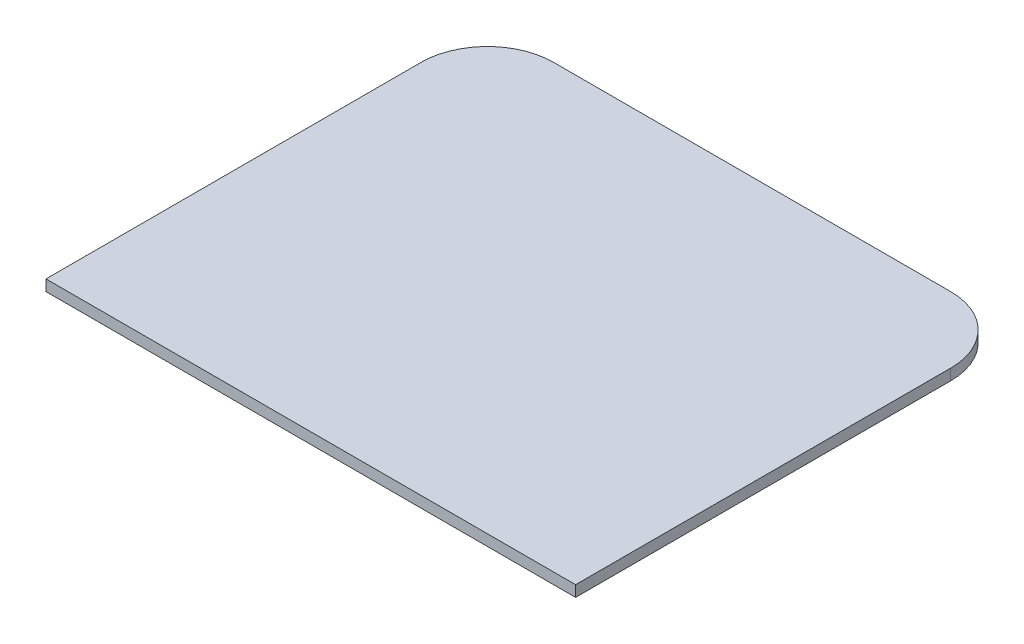
ISO-10303-21;
HEADER;
FILE_DESCRIPTION(('STEP AP214'),'2;1');
FILE_NAME('part.step','',(''),(''),'','','');
FILE_SCHEMA(('AUTOMOTIVE_DESIGN { 1 0 10303 214 1 1 1 1 }'));
ENDSEC;
DATA;
#1=APPLICATION_CONTEXT('core data for automotive mechanical design processes');
#2=APPLICATION_PROTOCOL_DEFINITION('international standard','automotive_design',2000,#1);
#3=PRODUCT_CONTEXT('',#1,'mechanical');
#4=PRODUCT('Part','Part','',(#3));
#5=PRODUCT_RELATED_PRODUCT_CATEGORY('part','',(#4));
#6=PRODUCT_DEFINITION_FORMATION('','',#4);
#7=PRODUCT_DEFINITION_CONTEXT('part definition',#1,'design');
#8=PRODUCT_DEFINITION('design','',#6,#7);
#9=PRODUCT_DEFINITION_SHAPE('','',#8);
#10=(LENGTH_UNIT() NAMED_UNIT(*) SI_UNIT(.MILLI.,.METRE.));
#11=(NAMED_UNIT(*) PLANE_ANGLE_UNIT() SI_UNIT($,.RADIAN.));
#12=(NAMED_UNIT(*) SI_UNIT($,.STERADIAN.) SOLID_ANGLE_UNIT());
#13=UNCERTAINTY_MEASURE_WITH_UNIT(LENGTH_MEASURE(1.E-05),#10,'distance_accuracy_value','');
#14=(GEOMETRIC_REPRESENTATION_CONTEXT(3) GLOBAL_UNCERTAINTY_ASSIGNED_CONTEXT((#13)) GLOBAL_UNIT_ASSIGNED_CONTEXT((#10,
#11,#12)) REPRESENTATION_CONTEXT('',''));
#15=CARTESIAN_POINT('',(0.,0.,0.));
#16=DIRECTION('',(0.,0.,1.));
#17=DIRECTION('',(1.,0.,0.));
#18=AXIS2_PLACEMENT_3D('',#15,#16,#17);
#19=CARTESIAN_POINT('',(94.8500088273931,3.175,65.9166879050208));
#20=DIRECTION('',(-1.,0.,0.));
#21=DIRECTION('',(0.,0.,1.));
#22=AXIS2_PLACEMENT_3D('',#19,#20,#21);
#23=PLANE('',#22);
#24=DIRECTION('',(0.,0.,-1.));
#25=VECTOR('',#24,1.);
#26=CARTESIAN_POINT('',(94.8500088273931,0.,65.9166879050208));
#27=LINE('',#26,#25);
#28=CARTESIAN_POINT('',(94.8500088273931,0.,65.9166879050208));
#29=VERTEX_POINT('',#28);
#30=CARTESIAN_POINT('',(94.8500088273931,0.,-42.0333120949792));
#31=VERTEX_POINT('',#30);
#32=EDGE_CURVE('E114',#29,#31,#27,.T.);
#33=ORIENTED_EDGE('',*,*,#32,.T.);
#34=DIRECTION('',(0.,-1.,0.));
#35=VECTOR('',#34,1.);
#36=CARTESIAN_POINT('',(94.8500088273931,3.175,-42.0333120949792));
#37=LINE('',#36,#35);
#38=CARTESIAN_POINT('',(94.8500088273931,3.175,-42.0333120949792));
#39=VERTEX_POINT('',#38);
#40=EDGE_CURVE('E41',#31,#39,#37,.F.);
#41=ORIENTED_EDGE('',*,*,#40,.T.);
#42=DIRECTION('',(0.,0.,-1.));
#43=VECTOR('',#42,1.);
#44=CARTESIAN_POINT('',(94.8500088273931,3.175,65.9166879050208));
#45=LINE('',#44,#43);
#46=CARTESIAN_POINT('',(94.8500088273931,3.175,65.9166879050208));
#47=VERTEX_POINT('',#46);
#48=EDGE_CURVE('E120',#47,#39,#45,.T.);
#49=ORIENTED_EDGE('',*,*,#48,.F.);
#50=DIRECTION('',(0.,-1.,0.));
#51=VECTOR('',#50,1.);
#52=CARTESIAN_POINT('',(94.8500088273931,3.175,65.9166879050208));
#53=LINE('',#52,#51);
#54=EDGE_CURVE('E106',#47,#29,#53,.T.);
#55=ORIENTED_EDGE('',*,*,#54,.T.);
#56=EDGE_LOOP('',(#33,#41,#49,#55));
#57=FACE_BOUND('',#56,.T.);
#58=ADVANCED_FACE('F33',(#57),#23,.F.);
#59=CARTESIAN_POINT('',(94.8500088273931,3.175,-61.0833120949792));
#60=DIRECTION('',(0.,0.,1.));
#61=DIRECTION('',(1.,0.,0.));
#62=AXIS2_PLACEMENT_3D('',#59,#60,#61);
#63=PLANE('',#62);
#64=DIRECTION('',(-1.,0.,0.));
#65=VECTOR('',#64,1.);
#66=CARTESIAN_POINT('',(94.8500088273931,3.175,-61.0833120949792));
#67=LINE('',#66,#65);
#68=CARTESIAN_POINT('',(75.8000088273931,3.175,-61.0833120949792));
#69=VERTEX_POINT('',#68);
#70=CARTESIAN_POINT('',(-38.4999911726069,3.175,-61.0833120949792));
#71=VERTEX_POINT('',#70);
#72=EDGE_CURVE('E96',#69,#71,#67,.T.);
#73=ORIENTED_EDGE('',*,*,#72,.F.);
#74=DIRECTION('',(0.,-1.,0.));
#75=VECTOR('',#74,1.);
#76=CARTESIAN_POINT('',(75.8000088273931,3.175,-61.0833120949792));
#77=LINE('',#76,#75);
#78=CARTESIAN_POINT('',(75.8000088273931,0.,-61.0833120949792));
#79=VERTEX_POINT('',#78);
#80=EDGE_CURVE('E130',#69,#79,#77,.T.);
#81=ORIENTED_EDGE('',*,*,#80,.T.);
#82=DIRECTION('',(-1.,0.,0.));
#83=VECTOR('',#82,1.);
#84=CARTESIAN_POINT('',(94.8500088273931,0.,-61.0833120949792));
#85=LINE('',#84,#83);
#86=CARTESIAN_POINT('',(-38.4999911726069,0.,-61.0833120949792));
#87=VERTEX_POINT('',#86);
#88=EDGE_CURVE('E116',#79,#87,#85,.T.);
#89=ORIENTED_EDGE('',*,*,#88,.T.);
#90=DIRECTION('',(0.,-1.,0.));
#91=VECTOR('',#90,1.);
#92=CARTESIAN_POINT('',(-38.499991172607,3.175,-61.0833120949792));
#93=LINE('',#92,#91);
#94=EDGE_CURVE('E126',#87,#71,#93,.F.);
#95=ORIENTED_EDGE('',*,*,#94,.T.);
#96=EDGE_LOOP('',(#73,#81,#89,#95));
#97=FACE_BOUND('',#96,.T.);
#98=ADVANCED_FACE('F136',(#97),#63,.F.);
#99=CARTESIAN_POINT('',(-57.549991172607,3.175,65.9166879050208));
#100=DIRECTION('',(1.,0.,0.));
#101=DIRECTION('',(0.,0.,-1.));
#102=AXIS2_PLACEMENT_3D('',#99,#100,#101);
#103=PLANE('',#102);
#104=DIRECTION('',(0.,0.,1.));
#105=VECTOR('',#104,1.);
#106=CARTESIAN_POINT('',(-57.549991172607,3.175,65.9166879050208));
#107=LINE('',#106,#105);
#108=CARTESIAN_POINT('',(-57.549991172607,3.175,-42.0333120949792));
#109=VERTEX_POINT('',#108);
#110=CARTESIAN_POINT('',(-57.549991172607,3.175,65.9166879050208));
#111=VERTEX_POINT('',#110);
#112=EDGE_CURVE('E85',#109,#111,#107,.T.);
#113=ORIENTED_EDGE('',*,*,#112,.F.);
#114=DIRECTION('',(0.,-1.,0.));
#115=VECTOR('',#114,1.);
#116=CARTESIAN_POINT('',(-57.549991172607,3.175,-42.0333120949792));
#117=LINE('',#116,#115);
#118=CARTESIAN_POINT('',(-57.549991172607,0.,-42.0333120949792));
#119=VERTEX_POINT('',#118);
#120=EDGE_CURVE('E105',#109,#119,#117,.T.);
#121=ORIENTED_EDGE('',*,*,#120,.T.);
#122=DIRECTION('',(0.,0.,1.));
#123=VECTOR('',#122,1.);
#124=CARTESIAN_POINT('',(-57.549991172607,0.,65.9166879050208));
#125=LINE('',#124,#123);
#126=CARTESIAN_POINT('',(-57.549991172607,0.,65.9166879050208));
#127=VERTEX_POINT('',#126);
#128=EDGE_CURVE('E102',#119,#127,#125,.T.);
#129=ORIENTED_EDGE('',*,*,#128,.T.);
#130=DIRECTION('',(0.,-1.,0.));
#131=VECTOR('',#130,1.);
#132=CARTESIAN_POINT('',(-57.549991172607,3.175,65.9166879050208));
#133=LINE('',#132,#131);
#134=EDGE_CURVE('E99',#111,#127,#133,.T.);
#135=ORIENTED_EDGE('',*,*,#134,.F.);
#136=EDGE_LOOP('',(#113,#121,#129,#135));
#137=FACE_BOUND('',#136,.T.);
#138=ADVANCED_FACE('F100',(#137),#103,.F.);
#139=CARTESIAN_POINT('',(94.8500088273931,3.175,65.9166879050208));
#140=DIRECTION('',(0.,0.,-1.));
#141=DIRECTION('',(-1.,0.,0.));
#142=AXIS2_PLACEMENT_3D('',#139,#140,#141);
#143=PLANE('',#142);
#144=DIRECTION('',(1.,0.,0.));
#145=VECTOR('',#144,1.);
#146=CARTESIAN_POINT('',(94.8500088273931,0.,65.9166879050208));
#147=LINE('',#146,#145);
#148=EDGE_CURVE('E119',#127,#29,#147,.T.);
#149=ORIENTED_EDGE('',*,*,#148,.T.);
#150=ORIENTED_EDGE('',*,*,#54,.F.);
#151=DIRECTION('',(1.,0.,0.));
#152=VECTOR('',#151,1.);
#153=CARTESIAN_POINT('',(94.8500088273931,3.175,65.9166879050208));
#154=LINE('',#153,#152);
#155=EDGE_CURVE('E89',#111,#47,#154,.T.);
#156=ORIENTED_EDGE('',*,*,#155,.F.);
#157=ORIENTED_EDGE('',*,*,#134,.T.);
#158=EDGE_LOOP('',(#149,#150,#156,#157));
#159=FACE_BOUND('',#158,.T.);
#160=ADVANCED_FACE('F108',(#159),#143,.F.);
#161=CARTESIAN_POINT('',(0.,3.175,0.));
#162=DIRECTION('',(0.,1.,0.));
#163=DIRECTION('',(0.,0.,1.));
#164=AXIS2_PLACEMENT_3D('',#161,#162,#163);
#165=PLANE('',#164);
#166=ORIENTED_EDGE('',*,*,#48,.T.);
#167=CARTESIAN_POINT('',(75.8000088273931,3.175,-42.0333120949792));
#168=DIRECTION('',(0.,1.,0.));
#169=DIRECTION('',(0.,0.,1.));
#170=AXIS2_PLACEMENT_3D('',#167,#168,#169);
#171=CIRCLE('',#170,19.05);
#172=EDGE_CURVE('E11',#39,#69,#171,.T.);
#173=ORIENTED_EDGE('',*,*,#172,.T.);
#174=ORIENTED_EDGE('',*,*,#72,.T.);
#175=CARTESIAN_POINT('',(-38.499991172607,3.175,-42.0333120949792));
#176=DIRECTION('',(0.,1.,0.));
#177=DIRECTION('',(0.,0.,1.));
#178=AXIS2_PLACEMENT_3D('',#175,#176,#177);
#179=CIRCLE('',#178,19.05);
#180=EDGE_CURVE('E92',#71,#109,#179,.T.);
#181=ORIENTED_EDGE('',*,*,#180,.T.);
#182=ORIENTED_EDGE('',*,*,#112,.T.);
#183=ORIENTED_EDGE('',*,*,#155,.T.);
#184=EDGE_LOOP('',(#166,#173,#174,#181,#182,#183));
#185=FACE_BOUND('',#184,.T.);
#186=ADVANCED_FACE('F87',(#185),#165,.T.);
#187=CARTESIAN_POINT('',(0.,0.,0.));
#188=DIRECTION('',(0.,1.,0.));
#189=DIRECTION('',(0.,0.,1.));
#190=AXIS2_PLACEMENT_3D('',#187,#188,#189);
#191=PLANE('',#190);
#192=ORIENTED_EDGE('',*,*,#88,.F.);
#193=CARTESIAN_POINT('',(75.8000088273931,0.,-42.0333120949792));
#194=DIRECTION('',(0.,1.,0.));
#195=DIRECTION('',(0.,0.,1.));
#196=AXIS2_PLACEMENT_3D('',#193,#194,#195);
#197=CIRCLE('',#196,19.05);
#198=EDGE_CURVE('E55',#79,#31,#197,.F.);
#199=ORIENTED_EDGE('',*,*,#198,.T.);
#200=ORIENTED_EDGE('',*,*,#32,.F.);
#201=ORIENTED_EDGE('',*,*,#148,.F.);
#202=ORIENTED_EDGE('',*,*,#128,.F.);
#203=CARTESIAN_POINT('',(-38.499991172607,0.,-42.0333120949792));
#204=DIRECTION('',(0.,1.,0.));
#205=DIRECTION('',(0.,0.,1.));
#206=AXIS2_PLACEMENT_3D('',#203,#204,#205);
#207=CIRCLE('',#206,19.05);
#208=EDGE_CURVE('E123',#119,#87,#207,.F.);
#209=ORIENTED_EDGE('',*,*,#208,.T.);
#210=EDGE_LOOP('',(#192,#199,#200,#201,#202,#209));
#211=FACE_BOUND('',#210,.T.);
#212=ADVANCED_FACE('F139',(#211),#191,.F.);
#213=CARTESIAN_POINT('',(-38.499991172607,3.175,-42.0333120949792));
#214=DIRECTION('',(0.,-1.,0.));
#215=DIRECTION('',(0.,0.,-1.));
#216=AXIS2_PLACEMENT_3D('',#213,#214,#215);
#217=CYLINDRICAL_SURFACE('',#216,19.05);
#218=ORIENTED_EDGE('',*,*,#180,.F.);
#219=ORIENTED_EDGE('',*,*,#94,.F.);
#220=ORIENTED_EDGE('',*,*,#208,.F.);
#221=ORIENTED_EDGE('',*,*,#120,.F.);
#222=EDGE_LOOP('',(#218,#219,#220,#221));
#223=FACE_BOUND('',#222,.T.);
#224=ADVANCED_FACE('F142',(#223),#217,.T.);
#225=CARTESIAN_POINT('',(75.8000088273931,3.175,-42.0333120949792));
#226=DIRECTION('',(0.,-1.,0.));
#227=DIRECTION('',(0.,0.,-1.));
#228=AXIS2_PLACEMENT_3D('',#225,#226,#227);
#229=CYLINDRICAL_SURFACE('',#228,19.05);
#230=ORIENTED_EDGE('',*,*,#172,.F.);
#231=ORIENTED_EDGE('',*,*,#40,.F.);
#232=ORIENTED_EDGE('',*,*,#198,.F.);
#233=ORIENTED_EDGE('',*,*,#80,.F.);
#234=EDGE_LOOP('',(#230,#231,#232,#233));
#235=FACE_BOUND('',#234,.T.);
#236=ADVANCED_FACE('F35',(#235),#229,.T.);
#237=CLOSED_SHELL('',(#58,#98,#138,#160,#186,#212,#224,#236));
#238=MANIFOLD_SOLID_BREP('B2',#237);
#239=ADVANCED_BREP_SHAPE_REPRESENTATION('',(#18,#238),#14);
#240=SHAPE_DEFINITION_REPRESENTATION(#9,#239);
ENDSEC;
END-ISO-10303-21;
